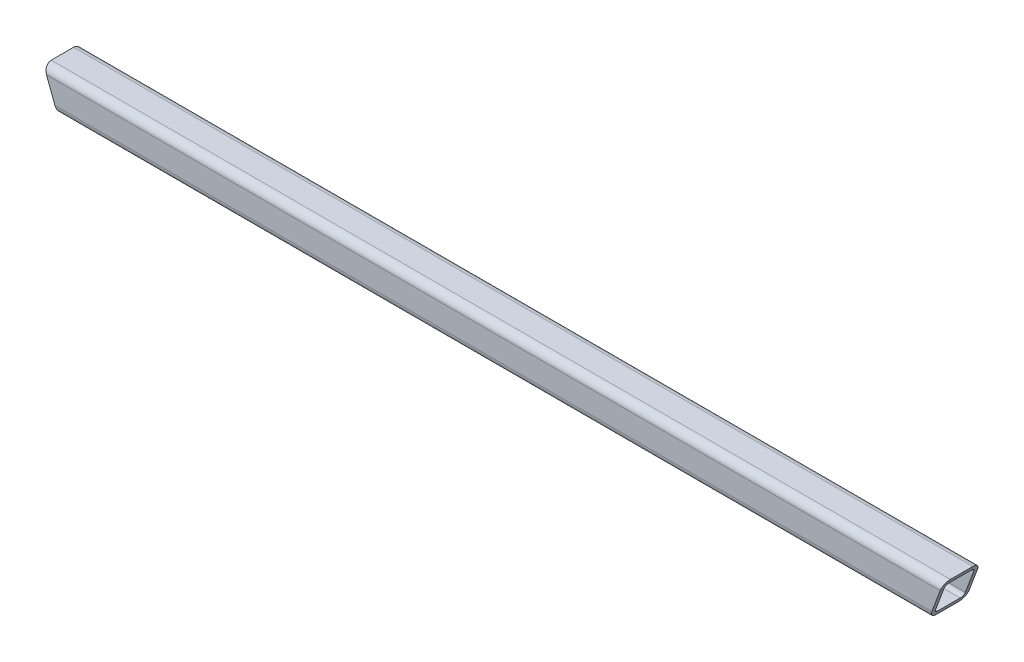
ISO-10303-21;
HEADER;
FILE_DESCRIPTION(('STEP AP214'),'2;1');
FILE_NAME('part.step','',(''),(''),'','','');
FILE_SCHEMA(('AUTOMOTIVE_DESIGN { 1 0 10303 214 1 1 1 1 }'));
ENDSEC;
DATA;
#1=APPLICATION_CONTEXT('core data for automotive mechanical design processes');
#2=APPLICATION_PROTOCOL_DEFINITION('international standard','automotive_design',2000,#1);
#3=PRODUCT_CONTEXT('',#1,'mechanical');
#4=PRODUCT('Part','Part','',(#3));
#5=PRODUCT_RELATED_PRODUCT_CATEGORY('part','',(#4));
#6=PRODUCT_DEFINITION_FORMATION('','',#4);
#7=PRODUCT_DEFINITION_CONTEXT('part definition',#1,'design');
#8=PRODUCT_DEFINITION('design','',#6,#7);
#9=PRODUCT_DEFINITION_SHAPE('','',#8);
#10=(LENGTH_UNIT() NAMED_UNIT(*) SI_UNIT(.MILLI.,.METRE.));
#11=(NAMED_UNIT(*) PLANE_ANGLE_UNIT() SI_UNIT($,.RADIAN.));
#12=(NAMED_UNIT(*) SI_UNIT($,.STERADIAN.) SOLID_ANGLE_UNIT());
#13=UNCERTAINTY_MEASURE_WITH_UNIT(LENGTH_MEASURE(1.E-05),#10,'distance_accuracy_value','');
#14=(GEOMETRIC_REPRESENTATION_CONTEXT(3) GLOBAL_UNCERTAINTY_ASSIGNED_CONTEXT((#13)) GLOBAL_UNIT_ASSIGNED_CONTEXT((#10,
#11,#12)) REPRESENTATION_CONTEXT('',''));
#15=CARTESIAN_POINT('',(0.,0.,0.));
#16=DIRECTION('',(0.,0.,1.));
#17=DIRECTION('',(1.,0.,0.));
#18=AXIS2_PLACEMENT_3D('',#15,#16,#17);
#19=CARTESIAN_POINT('',(225.,206.,1644.));
#20=DIRECTION('',(-1.,0.,0.));
#21=DIRECTION('',(0.,0.,1.));
#22=AXIS2_PLACEMENT_3D('',#19,#20,#21);
#23=CYLINDRICAL_SURFACE('',#22,4.);
#24=CARTESIAN_POINT('',(-239.772001872659,206.,1644.));
#25=DIRECTION('',(-0.936329177569044,-0.351123441588392,0.));
#26=DIRECTION('',(-0.351123441588392,0.936329177569044,0.));
#27=AXIS2_PLACEMENT_3D('',#24,#25,#26);
#28=ELLIPSE('',#27,4.27200187265877,4.);
#29=CARTESIAN_POINT('',(-241.272001872659,210.,1644.));
#30=VERTEX_POINT('',#29);
#31=CARTESIAN_POINT('',(-239.772001872659,206.,1640.));
#32=VERTEX_POINT('',#31);
#33=EDGE_CURVE('E183',#30,#32,#28,.T.);
#34=ORIENTED_EDGE('',*,*,#33,.F.);
#35=DIRECTION('',(-1.,0.,0.));
#36=VECTOR('',#35,1.);
#37=CARTESIAN_POINT('',(225.,210.,1644.));
#38=LINE('',#37,#36);
#39=CARTESIAN_POINT('',(241.272001872659,210.,1644.));
#40=VERTEX_POINT('',#39);
#41=EDGE_CURVE('E263',#40,#30,#38,.T.);
#42=ORIENTED_EDGE('',*,*,#41,.F.);
#43=CARTESIAN_POINT('',(239.772001872659,206.,1644.));
#44=DIRECTION('',(0.936329177569044,-0.351123441588392,0.));
#45=DIRECTION('',(-0.351123441588392,-0.936329177569044,0.));
#46=AXIS2_PLACEMENT_3D('',#43,#44,#45);
#47=ELLIPSE('',#46,4.27200187265877,4.);
#48=CARTESIAN_POINT('',(239.772001872659,206.,1640.));
#49=VERTEX_POINT('',#48);
#50=EDGE_CURVE('E174',#49,#40,#47,.T.);
#51=ORIENTED_EDGE('',*,*,#50,.F.);
#52=DIRECTION('',(-1.,0.,0.));
#53=VECTOR('',#52,1.);
#54=CARTESIAN_POINT('',(225.,206.,1640.));
#55=LINE('',#54,#53);
#56=EDGE_CURVE('E43',#49,#32,#55,.T.);
#57=ORIENTED_EDGE('',*,*,#56,.T.);
#58=EDGE_LOOP('',(#34,#42,#51,#57));
#59=FACE_BOUND('',#58,.T.);
#60=ADVANCED_FACE('F39',(#59),#23,.T.);
#61=CARTESIAN_POINT('',(225.,210.,1644.));
#62=DIRECTION('',(0.,-1.,0.));
#63=DIRECTION('',(0.,0.,-1.));
#64=AXIS2_PLACEMENT_3D('',#61,#62,#63);
#65=PLANE('',#64);
#66=DIRECTION('',(0.,0.,-1.));
#67=VECTOR('',#66,1.);
#68=CARTESIAN_POINT('',(-241.272001872659,210.,1644.));
#69=LINE('',#68,#67);
#70=CARTESIAN_POINT('',(-241.272001872659,210.,1656.));
#71=VERTEX_POINT('',#70);
#72=EDGE_CURVE('E180',#71,#30,#69,.T.);
#73=ORIENTED_EDGE('',*,*,#72,.F.);
#74=DIRECTION('',(-1.,0.,0.));
#75=VECTOR('',#74,1.);
#76=CARTESIAN_POINT('',(225.,210.,1656.));
#77=LINE('',#76,#75);
#78=CARTESIAN_POINT('',(241.272001872659,210.,1656.));
#79=VERTEX_POINT('',#78);
#80=EDGE_CURVE('E261',#79,#71,#77,.T.);
#81=ORIENTED_EDGE('',*,*,#80,.F.);
#82=DIRECTION('',(0.,0.,1.));
#83=VECTOR('',#82,1.);
#84=CARTESIAN_POINT('',(241.272001872659,210.,1644.));
#85=LINE('',#84,#83);
#86=EDGE_CURVE('E279',#40,#79,#85,.T.);
#87=ORIENTED_EDGE('',*,*,#86,.F.);
#88=ORIENTED_EDGE('',*,*,#41,.T.);
#89=EDGE_LOOP('',(#73,#81,#87,#88));
#90=FACE_BOUND('',#89,.T.);
#91=ADVANCED_FACE('F270',(#90),#65,.F.);
#92=CARTESIAN_POINT('',(225.,206.,1656.));
#93=DIRECTION('',(-1.,0.,0.));
#94=DIRECTION('',(0.,0.,1.));
#95=AXIS2_PLACEMENT_3D('',#92,#93,#94);
#96=CYLINDRICAL_SURFACE('',#95,4.);
#97=CARTESIAN_POINT('',(-239.772001872659,206.,1656.));
#98=DIRECTION('',(-0.936329177569044,-0.351123441588392,0.));
#99=DIRECTION('',(-0.351123441588392,0.936329177569044,0.));
#100=AXIS2_PLACEMENT_3D('',#97,#98,#99);
#101=ELLIPSE('',#100,4.27200187265877,4.);
#102=CARTESIAN_POINT('',(-239.772001872659,206.,1660.));
#103=VERTEX_POINT('',#102);
#104=EDGE_CURVE('E11',#103,#71,#101,.T.);
#105=ORIENTED_EDGE('',*,*,#104,.F.);
#106=DIRECTION('',(-1.,0.,0.));
#107=VECTOR('',#106,1.);
#108=CARTESIAN_POINT('',(225.,206.,1660.));
#109=LINE('',#108,#107);
#110=CARTESIAN_POINT('',(239.772001872659,206.,1660.));
#111=VERTEX_POINT('',#110);
#112=EDGE_CURVE('E258',#111,#103,#109,.T.);
#113=ORIENTED_EDGE('',*,*,#112,.F.);
#114=CARTESIAN_POINT('',(239.772001872659,206.,1656.));
#115=DIRECTION('',(0.936329177569044,-0.351123441588392,0.));
#116=DIRECTION('',(-0.351123441588392,-0.936329177569044,0.));
#117=AXIS2_PLACEMENT_3D('',#114,#115,#116);
#118=ELLIPSE('',#117,4.27200187265877,4.);
#119=EDGE_CURVE('E276',#79,#111,#118,.T.);
#120=ORIENTED_EDGE('',*,*,#119,.F.);
#121=ORIENTED_EDGE('',*,*,#80,.T.);
#122=EDGE_LOOP('',(#105,#113,#120,#121));
#123=FACE_BOUND('',#122,.T.);
#124=ADVANCED_FACE('F273',(#123),#96,.T.);
#125=CARTESIAN_POINT('',(225.,194.,1660.));
#126=DIRECTION('',(0.,0.,-1.));
#127=DIRECTION('',(-1.,0.,0.));
#128=AXIS2_PLACEMENT_3D('',#125,#126,#127);
#129=PLANE('',#128);
#130=DIRECTION('',(-0.351123441588392,0.936329177569044,0.));
#131=VECTOR('',#130,1.);
#132=CARTESIAN_POINT('',(-178.526138628084,42.6776980144682,1660.));
#133=LINE('',#132,#131);
#134=CARTESIAN_POINT('',(-235.272001872659,194.,1660.));
#135=VERTEX_POINT('',#134);
#136=EDGE_CURVE('E49',#135,#103,#133,.T.);
#137=ORIENTED_EDGE('',*,*,#136,.F.);
#138=DIRECTION('',(-1.,0.,0.));
#139=VECTOR('',#138,1.);
#140=CARTESIAN_POINT('',(225.,194.,1660.));
#141=LINE('',#140,#139);
#142=CARTESIAN_POINT('',(235.272001872659,194.,1660.));
#143=VERTEX_POINT('',#142);
#144=EDGE_CURVE('E255',#143,#135,#141,.T.);
#145=ORIENTED_EDGE('',*,*,#144,.F.);
#146=DIRECTION('',(-0.351123441588392,-0.936329177569044,0.));
#147=VECTOR('',#146,1.);
#148=CARTESIAN_POINT('',(234.005590682879,190.62290349392,1660.));
#149=LINE('',#148,#147);
#150=EDGE_CURVE('E278',#111,#143,#149,.T.);
#151=ORIENTED_EDGE('',*,*,#150,.F.);
#152=ORIENTED_EDGE('',*,*,#112,.T.);
#153=EDGE_LOOP('',(#137,#145,#151,#152));
#154=FACE_BOUND('',#153,.T.);
#155=ADVANCED_FACE('F289',(#154),#129,.F.);
#156=CARTESIAN_POINT('',(225.,194.,1656.));
#157=DIRECTION('',(-1.,0.,0.));
#158=DIRECTION('',(0.,0.,1.));
#159=AXIS2_PLACEMENT_3D('',#156,#157,#158);
#160=CYLINDRICAL_SURFACE('',#159,4.);
#161=CARTESIAN_POINT('',(-235.272001872659,194.,1656.));
#162=DIRECTION('',(-0.936329177569044,-0.351123441588392,0.));
#163=DIRECTION('',(-0.351123441588392,0.936329177569044,0.));
#164=AXIS2_PLACEMENT_3D('',#161,#162,#163);
#165=ELLIPSE('',#164,4.27200187265877,4.);
#166=CARTESIAN_POINT('',(-233.772001872659,190.,1656.));
#167=VERTEX_POINT('',#166);
#168=EDGE_CURVE('E198',#167,#135,#165,.T.);
#169=ORIENTED_EDGE('',*,*,#168,.F.);
#170=DIRECTION('',(-1.,0.,0.));
#171=VECTOR('',#170,1.);
#172=CARTESIAN_POINT('',(225.,190.,1656.));
#173=LINE('',#172,#171);
#174=CARTESIAN_POINT('',(233.772001872659,190.,1656.));
#175=VERTEX_POINT('',#174);
#176=EDGE_CURVE('E252',#175,#167,#173,.T.);
#177=ORIENTED_EDGE('',*,*,#176,.F.);
#178=CARTESIAN_POINT('',(235.272001872659,194.,1656.));
#179=DIRECTION('',(0.936329177569044,-0.351123441588392,0.));
#180=DIRECTION('',(-0.351123441588392,-0.936329177569044,0.));
#181=AXIS2_PLACEMENT_3D('',#178,#179,#180);
#182=ELLIPSE('',#181,4.27200187265877,4.);
#183=EDGE_CURVE('E185',#143,#175,#182,.T.);
#184=ORIENTED_EDGE('',*,*,#183,.F.);
#185=ORIENTED_EDGE('',*,*,#144,.T.);
#186=EDGE_LOOP('',(#169,#177,#184,#185));
#187=FACE_BOUND('',#186,.T.);
#188=ADVANCED_FACE('F287',(#187),#160,.T.);
#189=CARTESIAN_POINT('',(225.,190.,1656.));
#190=DIRECTION('',(0.,1.,0.));
#191=DIRECTION('',(0.,0.,1.));
#192=AXIS2_PLACEMENT_3D('',#189,#190,#191);
#193=PLANE('',#192);
#194=DIRECTION('',(0.,0.,1.));
#195=VECTOR('',#194,1.);
#196=CARTESIAN_POINT('',(-233.772001872659,190.,1656.));
#197=LINE('',#196,#195);
#198=CARTESIAN_POINT('',(-233.772001872659,190.,1644.));
#199=VERTEX_POINT('',#198);
#200=EDGE_CURVE('E201',#199,#167,#197,.T.);
#201=ORIENTED_EDGE('',*,*,#200,.F.);
#202=DIRECTION('',(-1.,0.,0.));
#203=VECTOR('',#202,1.);
#204=CARTESIAN_POINT('',(225.,190.,1644.));
#205=LINE('',#204,#203);
#206=CARTESIAN_POINT('',(233.772001872659,190.,1644.));
#207=VERTEX_POINT('',#206);
#208=EDGE_CURVE('E250',#207,#199,#205,.T.);
#209=ORIENTED_EDGE('',*,*,#208,.F.);
#210=DIRECTION('',(0.,0.,-1.));
#211=VECTOR('',#210,1.);
#212=CARTESIAN_POINT('',(233.772001872659,190.,1656.));
#213=LINE('',#212,#211);
#214=EDGE_CURVE('E179',#175,#207,#213,.T.);
#215=ORIENTED_EDGE('',*,*,#214,.F.);
#216=ORIENTED_EDGE('',*,*,#176,.T.);
#217=EDGE_LOOP('',(#201,#209,#215,#216));
#218=FACE_BOUND('',#217,.T.);
#219=ADVANCED_FACE('F291',(#218),#193,.F.);
#220=CARTESIAN_POINT('',(225.,194.,1644.));
#221=DIRECTION('',(-1.,0.,0.));
#222=DIRECTION('',(0.,0.,1.));
#223=AXIS2_PLACEMENT_3D('',#220,#221,#222);
#224=CYLINDRICAL_SURFACE('',#223,4.);
#225=CARTESIAN_POINT('',(-235.272001872659,194.,1644.));
#226=DIRECTION('',(-0.936329177569044,-0.351123441588392,0.));
#227=DIRECTION('',(-0.351123441588392,0.936329177569044,0.));
#228=AXIS2_PLACEMENT_3D('',#225,#226,#227);
#229=ELLIPSE('',#228,4.27200187265877,4.);
#230=CARTESIAN_POINT('',(-235.272001872659,194.,1640.));
#231=VERTEX_POINT('',#230);
#232=EDGE_CURVE('E162',#231,#199,#229,.T.);
#233=ORIENTED_EDGE('',*,*,#232,.F.);
#234=DIRECTION('',(-1.,0.,0.));
#235=VECTOR('',#234,1.);
#236=CARTESIAN_POINT('',(225.,194.,1640.));
#237=LINE('',#236,#235);
#238=CARTESIAN_POINT('',(235.272001872659,194.,1640.));
#239=VERTEX_POINT('',#238);
#240=EDGE_CURVE('E154',#239,#231,#237,.T.);
#241=ORIENTED_EDGE('',*,*,#240,.F.);
#242=CARTESIAN_POINT('',(235.272001872659,194.,1644.));
#243=DIRECTION('',(0.936329177569044,-0.351123441588392,0.));
#244=DIRECTION('',(-0.351123441588392,-0.936329177569044,0.));
#245=AXIS2_PLACEMENT_3D('',#242,#243,#244);
#246=ELLIPSE('',#245,4.27200187265877,4.);
#247=EDGE_CURVE('E159',#207,#239,#246,.T.);
#248=ORIENTED_EDGE('',*,*,#247,.F.);
#249=ORIENTED_EDGE('',*,*,#208,.T.);
#250=EDGE_LOOP('',(#233,#241,#248,#249));
#251=FACE_BOUND('',#250,.T.);
#252=ADVANCED_FACE('F156',(#251),#224,.T.);
#253=CARTESIAN_POINT('',(225.,206.,1656.));
#254=DIRECTION('',(-1.,0.,0.));
#255=DIRECTION('',(0.,0.,1.));
#256=AXIS2_PLACEMENT_3D('',#253,#254,#255);
#257=CYLINDRICAL_SURFACE('',#256,2.);
#258=DIRECTION('',(-1.,0.,0.));
#259=VECTOR('',#258,1.);
#260=CARTESIAN_POINT('',(225.,206.,1658.));
#261=LINE('',#260,#259);
#262=CARTESIAN_POINT('',(239.772001872659,206.,1658.));
#263=VERTEX_POINT('',#262);
#264=CARTESIAN_POINT('',(-239.772001872659,206.,1658.));
#265=VERTEX_POINT('',#264);
#266=EDGE_CURVE('E207',#263,#265,#261,.T.);
#267=ORIENTED_EDGE('',*,*,#266,.T.);
#268=CARTESIAN_POINT('',(-239.772001872659,206.,1656.));
#269=DIRECTION('',(-0.936329177569044,-0.351123441588392,0.));
#270=DIRECTION('',(-0.351123441588392,0.936329177569044,0.));
#271=AXIS2_PLACEMENT_3D('',#268,#269,#270);
#272=ELLIPSE('',#271,2.13600093632938,2.);
#273=CARTESIAN_POINT('',(-240.522001872659,208.,1656.));
#274=VERTEX_POINT('',#273);
#275=EDGE_CURVE('E85',#265,#274,#272,.T.);
#276=ORIENTED_EDGE('',*,*,#275,.T.);
#277=DIRECTION('',(-1.,0.,0.));
#278=VECTOR('',#277,1.);
#279=CARTESIAN_POINT('',(225.,208.,1656.));
#280=LINE('',#279,#278);
#281=CARTESIAN_POINT('',(240.522001872659,208.,1656.));
#282=VERTEX_POINT('',#281);
#283=EDGE_CURVE('E210',#282,#274,#280,.T.);
#284=ORIENTED_EDGE('',*,*,#283,.F.);
#285=CARTESIAN_POINT('',(239.772001872659,206.,1656.));
#286=DIRECTION('',(0.936329177569044,-0.351123441588392,0.));
#287=DIRECTION('',(-0.351123441588392,-0.936329177569044,0.));
#288=AXIS2_PLACEMENT_3D('',#285,#286,#287);
#289=ELLIPSE('',#288,2.13600093632938,2.);
#290=EDGE_CURVE('E206',#282,#263,#289,.T.);
#291=ORIENTED_EDGE('',*,*,#290,.T.);
#292=EDGE_LOOP('',(#267,#276,#284,#291));
#293=FACE_BOUND('',#292,.T.);
#294=ADVANCED_FACE('F299',(#293),#257,.F.);
#295=CARTESIAN_POINT('',(225.,208.,1644.));
#296=DIRECTION('',(0.,-1.,0.));
#297=DIRECTION('',(0.,0.,-1.));
#298=AXIS2_PLACEMENT_3D('',#295,#296,#297);
#299=PLANE('',#298);
#300=ORIENTED_EDGE('',*,*,#283,.T.);
#301=DIRECTION('',(0.,0.,-1.));
#302=VECTOR('',#301,1.);
#303=CARTESIAN_POINT('',(-240.522001872659,208.,1644.));
#304=LINE('',#303,#302);
#305=CARTESIAN_POINT('',(-240.522001872659,208.,1644.));
#306=VERTEX_POINT('',#305);
#307=EDGE_CURVE('E58',#274,#306,#304,.T.);
#308=ORIENTED_EDGE('',*,*,#307,.T.);
#309=DIRECTION('',(-1.,0.,0.));
#310=VECTOR('',#309,1.);
#311=CARTESIAN_POINT('',(225.,208.,1644.));
#312=LINE('',#311,#310);
#313=CARTESIAN_POINT('',(240.522001872659,208.,1644.));
#314=VERTEX_POINT('',#313);
#315=EDGE_CURVE('E215',#314,#306,#312,.T.);
#316=ORIENTED_EDGE('',*,*,#315,.F.);
#317=DIRECTION('',(0.,0.,1.));
#318=VECTOR('',#317,1.);
#319=CARTESIAN_POINT('',(240.522001872659,208.,1644.));
#320=LINE('',#319,#318);
#321=EDGE_CURVE('E209',#314,#282,#320,.T.);
#322=ORIENTED_EDGE('',*,*,#321,.T.);
#323=EDGE_LOOP('',(#300,#308,#316,#322));
#324=FACE_BOUND('',#323,.T.);
#325=ADVANCED_FACE('F347',(#324),#299,.T.);
#326=CARTESIAN_POINT('',(225.,206.,1644.));
#327=DIRECTION('',(-1.,0.,0.));
#328=DIRECTION('',(0.,0.,1.));
#329=AXIS2_PLACEMENT_3D('',#326,#327,#328);
#330=CYLINDRICAL_SURFACE('',#329,2.);
#331=ORIENTED_EDGE('',*,*,#315,.T.);
#332=CARTESIAN_POINT('',(-239.772001872659,206.,1644.));
#333=DIRECTION('',(-0.936329177569044,-0.351123441588392,0.));
#334=DIRECTION('',(-0.351123441588392,0.936329177569044,0.));
#335=AXIS2_PLACEMENT_3D('',#332,#333,#334);
#336=ELLIPSE('',#335,2.13600093632938,2.);
#337=CARTESIAN_POINT('',(-239.772001872659,206.,1642.));
#338=VERTEX_POINT('',#337);
#339=EDGE_CURVE('E211',#306,#338,#336,.T.);
#340=ORIENTED_EDGE('',*,*,#339,.T.);
#341=DIRECTION('',(-1.,0.,0.));
#342=VECTOR('',#341,1.);
#343=CARTESIAN_POINT('',(225.,206.,1642.));
#344=LINE('',#343,#342);
#345=CARTESIAN_POINT('',(239.772001872659,206.,1642.));
#346=VERTEX_POINT('',#345);
#347=EDGE_CURVE('E220',#346,#338,#344,.T.);
#348=ORIENTED_EDGE('',*,*,#347,.F.);
#349=CARTESIAN_POINT('',(239.772001872659,206.,1644.));
#350=DIRECTION('',(0.936329177569044,-0.351123441588392,0.));
#351=DIRECTION('',(-0.351123441588392,-0.936329177569044,0.));
#352=AXIS2_PLACEMENT_3D('',#349,#350,#351);
#353=ELLIPSE('',#352,2.13600093632938,2.);
#354=EDGE_CURVE('E214',#346,#314,#353,.T.);
#355=ORIENTED_EDGE('',*,*,#354,.T.);
#356=EDGE_LOOP('',(#331,#340,#348,#355));
#357=FACE_BOUND('',#356,.T.);
#358=ADVANCED_FACE('F355',(#357),#330,.F.);
#359=CARTESIAN_POINT('',(225.,206.,1642.));
#360=DIRECTION('',(0.,0.,1.));
#361=DIRECTION('',(1.,0.,0.));
#362=AXIS2_PLACEMENT_3D('',#359,#360,#361);
#363=PLANE('',#362);
#364=ORIENTED_EDGE('',*,*,#347,.T.);
#365=DIRECTION('',(0.351123441588392,-0.936329177569044,0.));
#366=VECTOR('',#365,1.);
#367=CARTESIAN_POINT('',(-182.471344107536,53.1982459596738,1642.));
#368=LINE('',#367,#366);
#369=CARTESIAN_POINT('',(-235.272001872659,194.,1642.));
#370=VERTEX_POINT('',#369);
#371=EDGE_CURVE('E216',#338,#370,#368,.T.);
#372=ORIENTED_EDGE('',*,*,#371,.T.);
#373=DIRECTION('',(-1.,0.,0.));
#374=VECTOR('',#373,1.);
#375=CARTESIAN_POINT('',(225.,194.,1642.));
#376=LINE('',#375,#374);
#377=CARTESIAN_POINT('',(235.272001872659,194.,1642.));
#378=VERTEX_POINT('',#377);
#379=EDGE_CURVE('E225',#378,#370,#376,.T.);
#380=ORIENTED_EDGE('',*,*,#379,.F.);
#381=DIRECTION('',(0.351123441588392,0.936329177569044,0.));
#382=VECTOR('',#381,1.);
#383=CARTESIAN_POINT('',(237.950796162331,201.143451439126,1642.));
#384=LINE('',#383,#382);
#385=EDGE_CURVE('E219',#378,#346,#384,.T.);
#386=ORIENTED_EDGE('',*,*,#385,.T.);
#387=EDGE_LOOP('',(#364,#372,#380,#386));
#388=FACE_BOUND('',#387,.T.);
#389=ADVANCED_FACE('F363',(#388),#363,.T.);
#390=CARTESIAN_POINT('',(225.,194.,1644.));
#391=DIRECTION('',(-1.,0.,0.));
#392=DIRECTION('',(0.,0.,1.));
#393=AXIS2_PLACEMENT_3D('',#390,#391,#392);
#394=CYLINDRICAL_SURFACE('',#393,2.);
#395=ORIENTED_EDGE('',*,*,#379,.T.);
#396=CARTESIAN_POINT('',(-235.272001872659,194.,1644.));
#397=DIRECTION('',(-0.936329177569044,-0.351123441588392,0.));
#398=DIRECTION('',(-0.351123441588392,0.936329177569044,0.));
#399=AXIS2_PLACEMENT_3D('',#396,#397,#398);
#400=ELLIPSE('',#399,2.13600093632938,2.);
#401=CARTESIAN_POINT('',(-234.522001872659,192.,1644.));
#402=VERTEX_POINT('',#401);
#403=EDGE_CURVE('E221',#370,#402,#400,.T.);
#404=ORIENTED_EDGE('',*,*,#403,.T.);
#405=DIRECTION('',(-1.,0.,0.));
#406=VECTOR('',#405,1.);
#407=CARTESIAN_POINT('',(225.,192.,1644.));
#408=LINE('',#407,#406);
#409=CARTESIAN_POINT('',(234.522001872659,192.,1644.));
#410=VERTEX_POINT('',#409);
#411=EDGE_CURVE('E230',#410,#402,#408,.T.);
#412=ORIENTED_EDGE('',*,*,#411,.F.);
#413=CARTESIAN_POINT('',(235.272001872659,194.,1644.));
#414=DIRECTION('',(0.936329177569044,-0.351123441588392,0.));
#415=DIRECTION('',(-0.351123441588392,-0.936329177569044,0.));
#416=AXIS2_PLACEMENT_3D('',#413,#414,#415);
#417=ELLIPSE('',#416,2.13600093632938,2.);
#418=EDGE_CURVE('E224',#410,#378,#417,.T.);
#419=ORIENTED_EDGE('',*,*,#418,.T.);
#420=EDGE_LOOP('',(#395,#404,#412,#419));
#421=FACE_BOUND('',#420,.T.);
#422=ADVANCED_FACE('F371',(#421),#394,.F.);
#423=CARTESIAN_POINT('',(225.,192.,1656.));
#424=DIRECTION('',(0.,1.,0.));
#425=DIRECTION('',(0.,0.,1.));
#426=AXIS2_PLACEMENT_3D('',#423,#424,#425);
#427=PLANE('',#426);
#428=ORIENTED_EDGE('',*,*,#411,.T.);
#429=DIRECTION('',(0.,0.,1.));
#430=VECTOR('',#429,1.);
#431=CARTESIAN_POINT('',(-234.522001872659,192.,1656.));
#432=LINE('',#431,#430);
#433=CARTESIAN_POINT('',(-234.522001872659,192.,1656.));
#434=VERTEX_POINT('',#433);
#435=EDGE_CURVE('E226',#402,#434,#432,.T.);
#436=ORIENTED_EDGE('',*,*,#435,.T.);
#437=DIRECTION('',(-1.,0.,0.));
#438=VECTOR('',#437,1.);
#439=CARTESIAN_POINT('',(225.,192.,1656.));
#440=LINE('',#439,#438);
#441=CARTESIAN_POINT('',(234.522001872659,192.,1656.));
#442=VERTEX_POINT('',#441);
#443=EDGE_CURVE('E234',#442,#434,#440,.T.);
#444=ORIENTED_EDGE('',*,*,#443,.F.);
#445=DIRECTION('',(0.,0.,-1.));
#446=VECTOR('',#445,1.);
#447=CARTESIAN_POINT('',(234.522001872659,192.,1656.));
#448=LINE('',#447,#446);
#449=EDGE_CURVE('E229',#442,#410,#448,.T.);
#450=ORIENTED_EDGE('',*,*,#449,.T.);
#451=EDGE_LOOP('',(#428,#436,#444,#450));
#452=FACE_BOUND('',#451,.T.);
#453=ADVANCED_FACE('F379',(#452),#427,.T.);
#454=CARTESIAN_POINT('',(225.,194.,1656.));
#455=DIRECTION('',(-1.,0.,0.));
#456=DIRECTION('',(0.,0.,1.));
#457=AXIS2_PLACEMENT_3D('',#454,#455,#456);
#458=CYLINDRICAL_SURFACE('',#457,2.);
#459=ORIENTED_EDGE('',*,*,#443,.T.);
#460=CARTESIAN_POINT('',(-235.272001872659,194.,1656.));
#461=DIRECTION('',(-0.936329177569044,-0.351123441588392,0.));
#462=DIRECTION('',(-0.351123441588392,0.936329177569044,0.));
#463=AXIS2_PLACEMENT_3D('',#460,#461,#462);
#464=ELLIPSE('',#463,2.13600093632938,2.);
#465=CARTESIAN_POINT('',(-235.272001872659,194.,1658.));
#466=VERTEX_POINT('',#465);
#467=EDGE_CURVE('E231',#434,#466,#464,.T.);
#468=ORIENTED_EDGE('',*,*,#467,.T.);
#469=DIRECTION('',(-1.,0.,0.));
#470=VECTOR('',#469,1.);
#471=CARTESIAN_POINT('',(225.,194.,1658.));
#472=LINE('',#471,#470);
#473=CARTESIAN_POINT('',(235.272001872659,194.,1658.));
#474=VERTEX_POINT('',#473);
#475=EDGE_CURVE('E192',#474,#466,#472,.T.);
#476=ORIENTED_EDGE('',*,*,#475,.F.);
#477=CARTESIAN_POINT('',(235.272001872659,194.,1656.));
#478=DIRECTION('',(0.936329177569044,-0.351123441588392,0.));
#479=DIRECTION('',(-0.351123441588392,-0.936329177569044,0.));
#480=AXIS2_PLACEMENT_3D('',#477,#478,#479);
#481=ELLIPSE('',#480,2.13600093632938,2.);
#482=EDGE_CURVE('E233',#474,#442,#481,.T.);
#483=ORIENTED_EDGE('',*,*,#482,.T.);
#484=EDGE_LOOP('',(#459,#468,#476,#483));
#485=FACE_BOUND('',#484,.T.);
#486=ADVANCED_FACE('F387',(#485),#458,.F.);
#487=CARTESIAN_POINT('',(225.,194.,1658.));
#488=DIRECTION('',(0.,0.,-1.));
#489=DIRECTION('',(-1.,0.,0.));
#490=AXIS2_PLACEMENT_3D('',#487,#488,#489);
#491=PLANE('',#490);
#492=ORIENTED_EDGE('',*,*,#475,.T.);
#493=DIRECTION('',(-0.351123441588392,0.936329177569044,0.));
#494=VECTOR('',#493,1.);
#495=CARTESIAN_POINT('',(-178.526138628084,42.6776980144682,1658.));
#496=LINE('',#495,#494);
#497=EDGE_CURVE('E80',#466,#265,#496,.T.);
#498=ORIENTED_EDGE('',*,*,#497,.T.);
#499=ORIENTED_EDGE('',*,*,#266,.F.);
#500=DIRECTION('',(-0.351123441588392,-0.936329177569044,0.));
#501=VECTOR('',#500,1.);
#502=CARTESIAN_POINT('',(234.005590682879,190.62290349392,1658.));
#503=LINE('',#502,#501);
#504=EDGE_CURVE('E167',#263,#474,#503,.T.);
#505=ORIENTED_EDGE('',*,*,#504,.T.);
#506=EDGE_LOOP('',(#492,#498,#499,#505));
#507=FACE_BOUND('',#506,.T.);
#508=ADVANCED_FACE('F395',(#507),#491,.T.);
#509=CARTESIAN_POINT('',(225.,206.,1640.));
#510=DIRECTION('',(0.,0.,1.));
#511=DIRECTION('',(1.,0.,0.));
#512=AXIS2_PLACEMENT_3D('',#509,#510,#511);
#513=PLANE('',#512);
#514=DIRECTION('',(0.351123441588392,-0.936329177569044,0.));
#515=VECTOR('',#514,1.);
#516=CARTESIAN_POINT('',(-182.471344107536,53.1982459596738,1640.));
#517=LINE('',#516,#515);
#518=EDGE_CURVE('E194',#32,#231,#517,.T.);
#519=ORIENTED_EDGE('',*,*,#518,.F.);
#520=ORIENTED_EDGE('',*,*,#56,.F.);
#521=DIRECTION('',(0.351123441588392,0.936329177569044,0.));
#522=VECTOR('',#521,1.);
#523=CARTESIAN_POINT('',(237.950796162331,201.143451439126,1640.));
#524=LINE('',#523,#522);
#525=EDGE_CURVE('E166',#239,#49,#524,.T.);
#526=ORIENTED_EDGE('',*,*,#525,.F.);
#527=ORIENTED_EDGE('',*,*,#240,.T.);
#528=EDGE_LOOP('',(#519,#520,#526,#527));
#529=FACE_BOUND('',#528,.T.);
#530=ADVANCED_FACE('F170',(#529),#513,.F.);
#531=CARTESIAN_POINT('',(235.978193422605,195.883177466523,1638.27528428506));
#532=DIRECTION('',(0.936329177569044,-0.351123441588392,0.));
#533=DIRECTION('',(0.351123441588392,0.936329177569044,0.));
#534=AXIS2_PLACEMENT_3D('',#531,#532,#533);
#535=PLANE('',#534);
#536=ORIENTED_EDGE('',*,*,#290,.F.);
#537=ORIENTED_EDGE('',*,*,#321,.F.);
#538=ORIENTED_EDGE('',*,*,#354,.F.);
#539=ORIENTED_EDGE('',*,*,#385,.F.);
#540=ORIENTED_EDGE('',*,*,#418,.F.);
#541=ORIENTED_EDGE('',*,*,#449,.F.);
#542=ORIENTED_EDGE('',*,*,#482,.F.);
#543=ORIENTED_EDGE('',*,*,#504,.F.);
#544=EDGE_LOOP('',(#536,#537,#538,#539,#540,#541,#542,#543));
#545=FACE_BOUND('',#544,.T.);
#546=ORIENTED_EDGE('',*,*,#525,.T.);
#547=ORIENTED_EDGE('',*,*,#50,.T.);
#548=ORIENTED_EDGE('',*,*,#86,.T.);
#549=ORIENTED_EDGE('',*,*,#119,.T.);
#550=ORIENTED_EDGE('',*,*,#150,.T.);
#551=ORIENTED_EDGE('',*,*,#183,.T.);
#552=ORIENTED_EDGE('',*,*,#214,.T.);
#553=ORIENTED_EDGE('',*,*,#247,.T.);
#554=EDGE_LOOP('',(#546,#547,#548,#549,#550,#551,#552,#553));
#555=FACE_BOUND('',#554,.T.);
#556=ADVANCED_FACE('F177',(#545,#555),#535,.T.);
#557=CARTESIAN_POINT('',(-235.978193422605,195.883177466523,1661.72471571494));
#558=DIRECTION('',(-0.936329177569044,-0.351123441588392,0.));
#559=DIRECTION('',(0.351123441588392,-0.936329177569044,0.));
#560=AXIS2_PLACEMENT_3D('',#557,#558,#559);
#561=PLANE('',#560);
#562=ORIENTED_EDGE('',*,*,#275,.F.);
#563=ORIENTED_EDGE('',*,*,#497,.F.);
#564=ORIENTED_EDGE('',*,*,#467,.F.);
#565=ORIENTED_EDGE('',*,*,#435,.F.);
#566=ORIENTED_EDGE('',*,*,#403,.F.);
#567=ORIENTED_EDGE('',*,*,#371,.F.);
#568=ORIENTED_EDGE('',*,*,#339,.F.);
#569=ORIENTED_EDGE('',*,*,#307,.F.);
#570=EDGE_LOOP('',(#562,#563,#564,#565,#566,#567,#568,#569));
#571=FACE_BOUND('',#570,.T.);
#572=ORIENTED_EDGE('',*,*,#72,.T.);
#573=ORIENTED_EDGE('',*,*,#33,.T.);
#574=ORIENTED_EDGE('',*,*,#518,.T.);
#575=ORIENTED_EDGE('',*,*,#232,.T.);
#576=ORIENTED_EDGE('',*,*,#200,.T.);
#577=ORIENTED_EDGE('',*,*,#168,.T.);
#578=ORIENTED_EDGE('',*,*,#136,.T.);
#579=ORIENTED_EDGE('',*,*,#104,.T.);
#580=EDGE_LOOP('',(#572,#573,#574,#575,#576,#577,#578,#579));
#581=FACE_BOUND('',#580,.T.);
#582=ADVANCED_FACE('F41',(#571,#581),#561,.T.);
#583=CLOSED_SHELL('',(#60,#91,#124,#155,#188,#219,#252,#294,#325,#358,#389,#422,#453,#486,#508,
#530,#556,#582));
#584=MANIFOLD_SOLID_BREP('B2',#583);
#585=ADVANCED_BREP_SHAPE_REPRESENTATION('',(#18,#584),#14);
#586=SHAPE_DEFINITION_REPRESENTATION(#9,#585);
ENDSEC;
END-ISO-10303-21;
